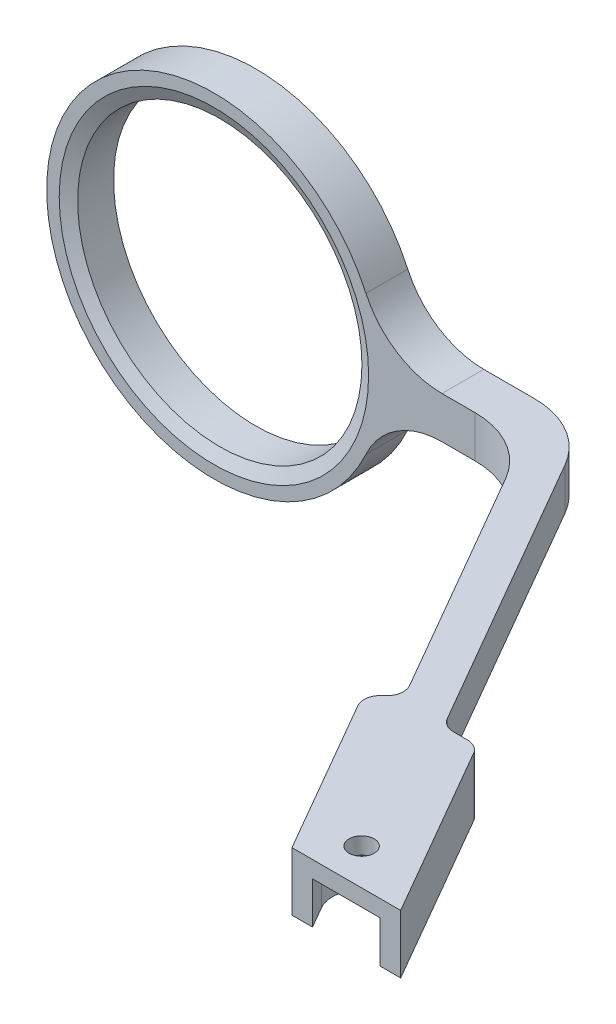
ISO-10303-21;
HEADER;
FILE_DESCRIPTION(('STEP AP214'),'2;1');
FILE_NAME('part.step','',(''),(''),'','','');
FILE_SCHEMA(('AUTOMOTIVE_DESIGN { 1 0 10303 214 1 1 1 1 }'));
ENDSEC;
DATA;
#1=APPLICATION_CONTEXT('core data for automotive mechanical design processes');
#2=APPLICATION_PROTOCOL_DEFINITION('international standard','automotive_design',2000,#1);
#3=PRODUCT_CONTEXT('',#1,'mechanical');
#4=PRODUCT('Part','Part','',(#3));
#5=PRODUCT_RELATED_PRODUCT_CATEGORY('part','',(#4));
#6=PRODUCT_DEFINITION_FORMATION('','',#4);
#7=PRODUCT_DEFINITION_CONTEXT('part definition',#1,'design');
#8=PRODUCT_DEFINITION('design','',#6,#7);
#9=PRODUCT_DEFINITION_SHAPE('','',#8);
#10=(LENGTH_UNIT() NAMED_UNIT(*) SI_UNIT(.MILLI.,.METRE.));
#11=(NAMED_UNIT(*) PLANE_ANGLE_UNIT() SI_UNIT($,.RADIAN.));
#12=(NAMED_UNIT(*) SI_UNIT($,.STERADIAN.) SOLID_ANGLE_UNIT());
#13=UNCERTAINTY_MEASURE_WITH_UNIT(LENGTH_MEASURE(1.E-05),#10,'distance_accuracy_value','');
#14=(GEOMETRIC_REPRESENTATION_CONTEXT(3) GLOBAL_UNCERTAINTY_ASSIGNED_CONTEXT((#13)) GLOBAL_UNIT_ASSIGNED_CONTEXT((#10,
#11,#12)) REPRESENTATION_CONTEXT('',''));
#15=CARTESIAN_POINT('',(0.,0.,0.));
#16=DIRECTION('',(0.,0.,1.));
#17=DIRECTION('',(1.,0.,0.));
#18=AXIS2_PLACEMENT_3D('',#15,#16,#17);
#19=CARTESIAN_POINT('',(69.3316150746193,0.500000000000026,56.6698729810778));
#20=DIRECTION('',(0.,-1.,0.));
#21=DIRECTION('',(1.,0.,0.));
#22=AXIS2_PLACEMENT_3D('',#19,#20,#21);
#23=CYLINDRICAL_SURFACE('',#22,3.50000000000001);
#24=DIRECTION('',(0.,-1.,0.));
#25=VECTOR('',#24,1.);
#26=CARTESIAN_POINT('',(65.9418066937666,0.500000000000025,55.7985526375181));
#27=LINE('',#26,#25);
#28=CARTESIAN_POINT('',(65.9418066937666,0.500000000000025,55.7985526375181));
#29=VERTEX_POINT('',#28);
#30=CARTESIAN_POINT('',(65.9418066937666,-0.999999999999975,55.7985526375181));
#31=VERTEX_POINT('',#30);
#32=EDGE_CURVE('E224',#29,#31,#27,.T.);
#33=ORIENTED_EDGE('',*,*,#32,.F.);
#34=CARTESIAN_POINT('',(69.3316150746193,0.500000000000026,56.6698729810778));
#35=DIRECTION('',(0.,-1.,0.));
#36=DIRECTION('',(1.,0.,0.));
#37=AXIS2_PLACEMENT_3D('',#34,#35,#36);
#38=CIRCLE('',#37,3.50000000000001);
#39=CARTESIAN_POINT('',(66.3005261613738,0.500000000000026,58.4198729810778));
#40=VERTEX_POINT('',#39);
#41=EDGE_CURVE('E251',#40,#29,#38,.T.);
#42=ORIENTED_EDGE('',*,*,#41,.F.);
#43=DIRECTION('',(0.,-1.,0.));
#44=VECTOR('',#43,1.);
#45=CARTESIAN_POINT('',(66.3005261613738,0.500000000000026,58.4198729810778));
#46=LINE('',#45,#44);
#47=CARTESIAN_POINT('',(66.3005261613738,-4.49999999999997,58.4198729810778));
#48=VERTEX_POINT('',#47);
#49=EDGE_CURVE('E270',#40,#48,#46,.T.);
#50=ORIENTED_EDGE('',*,*,#49,.T.);
#51=CARTESIAN_POINT('',(69.3316150746193,-4.49999999999997,56.6698729810778));
#52=DIRECTION('',(0.,-1.,0.));
#53=DIRECTION('',(1.,0.,0.));
#54=AXIS2_PLACEMENT_3D('',#51,#52,#53);
#55=CIRCLE('',#54,3.50000000000001);
#56=CARTESIAN_POINT('',(72.3627039878648,-4.49999999999997,54.9198729810778));
#57=VERTEX_POINT('',#56);
#58=EDGE_CURVE('E250',#48,#57,#55,.T.);
#59=ORIENTED_EDGE('',*,*,#58,.T.);
#60=DIRECTION('',(0.,-1.,0.));
#61=VECTOR('',#60,1.);
#62=CARTESIAN_POINT('',(72.3627039878648,0.500000000000029,54.9198729810778));
#63=LINE('',#62,#61);
#64=CARTESIAN_POINT('',(72.3627039878648,0.500000000000029,54.9198729810778));
#65=VERTEX_POINT('',#64);
#66=EDGE_CURVE('E263',#65,#57,#63,.T.);
#67=ORIENTED_EDGE('',*,*,#66,.F.);
#68=CARTESIAN_POINT('',(70.2719337126888,0.500000000000027,53.2985526375181));
#69=VERTEX_POINT('',#68);
#70=EDGE_CURVE('E255',#69,#65,#38,.T.);
#71=ORIENTED_EDGE('',*,*,#70,.F.);
#72=DIRECTION('',(0.,-1.,0.));
#73=VECTOR('',#72,1.);
#74=CARTESIAN_POINT('',(70.2719337126888,0.500000000000027,53.2985526375182));
#75=LINE('',#74,#73);
#76=CARTESIAN_POINT('',(70.2719337126888,-0.999999999999972,53.2985526375181));
#77=VERTEX_POINT('',#76);
#78=EDGE_CURVE('E241',#77,#69,#75,.F.);
#79=ORIENTED_EDGE('',*,*,#78,.F.);
#80=CARTESIAN_POINT('',(69.3316150746193,-0.999999999999973,56.6698729810778));
#81=DIRECTION('',(0.,-1.,0.));
#82=DIRECTION('',(1.,0.,0.));
#83=AXIS2_PLACEMENT_3D('',#80,#81,#82);
#84=CIRCLE('',#83,3.50000000000001);
#85=EDGE_CURVE('E363',#77,#31,#84,.F.);
#86=ORIENTED_EDGE('',*,*,#85,.T.);
#87=EDGE_LOOP('',(#33,#42,#50,#59,#67,#71,#79,#86));
#88=FACE_BOUND('',#87,.T.);
#89=ADVANCED_FACE('F46',(#88),#23,.F.);
#90=CARTESIAN_POINT('',(74.3316150746192,-74.0167776404917,61.));
#91=DIRECTION('',(0.,0.,1.));
#92=DIRECTION('',(1.,0.,0.));
#93=AXIS2_PLACEMENT_3D('',#90,#91,#92);
#94=PLANE('',#93);
#95=DIRECTION('',(1.,0.,0.));
#96=VECTOR('',#95,1.);
#97=CARTESIAN_POINT('',(65.3316150746193,-4.49999999999998,61.));
#98=LINE('',#97,#96);
#99=CARTESIAN_POINT('',(65.3316150746193,-4.49999999999998,61.));
#100=VERTEX_POINT('',#99);
#101=CARTESIAN_POINT('',(67.7901631902919,-4.49999999999997,61.));
#102=VERTEX_POINT('',#101);
#103=EDGE_CURVE('E284',#100,#102,#98,.T.);
#104=ORIENTED_EDGE('',*,*,#103,.T.);
#105=DIRECTION('',(0.,-1.,0.));
#106=VECTOR('',#105,1.);
#107=CARTESIAN_POINT('',(67.7901631902919,0.500000000000026,61.));
#108=LINE('',#107,#106);
#109=CARTESIAN_POINT('',(67.7901631902919,0.500000000000026,61.));
#110=VERTEX_POINT('',#109);
#111=EDGE_CURVE('E273',#110,#102,#108,.T.);
#112=ORIENTED_EDGE('',*,*,#111,.F.);
#113=DIRECTION('',(-1.,0.,0.));
#114=VECTOR('',#113,1.);
#115=CARTESIAN_POINT('',(0.,0.49999999999999,61.));
#116=LINE('',#115,#114);
#117=CARTESIAN_POINT('',(75.8730669589466,0.500000000000031,61.));
#118=VERTEX_POINT('',#117);
#119=EDGE_CURVE('E258',#118,#110,#116,.T.);
#120=ORIENTED_EDGE('',*,*,#119,.F.);
#121=DIRECTION('',(0.,-1.,0.));
#122=VECTOR('',#121,1.);
#123=CARTESIAN_POINT('',(75.8730669589466,0.500000000000031,61.));
#124=LINE('',#123,#122);
#125=CARTESIAN_POINT('',(75.8730669589466,-4.49999999999997,61.));
#126=VERTEX_POINT('',#125);
#127=EDGE_CURVE('E275',#118,#126,#124,.T.);
#128=ORIENTED_EDGE('',*,*,#127,.T.);
#129=CARTESIAN_POINT('',(78.3316150746193,-4.49999999999997,61.));
#130=VERTEX_POINT('',#129);
#131=EDGE_CURVE('E282',#126,#130,#98,.T.);
#132=ORIENTED_EDGE('',*,*,#131,.T.);
#133=DIRECTION('',(0.,1.,0.));
#134=VECTOR('',#133,1.);
#135=CARTESIAN_POINT('',(78.3316150746193,-4.49999999999997,61.));
#136=LINE('',#135,#134);
#137=CARTESIAN_POINT('',(78.3316150746193,2.50000000000003,61.));
#138=VERTEX_POINT('',#137);
#139=EDGE_CURVE('E300',#130,#138,#136,.T.);
#140=ORIENTED_EDGE('',*,*,#139,.T.);
#141=DIRECTION('',(1.,0.,0.));
#142=VECTOR('',#141,1.);
#143=CARTESIAN_POINT('',(74.3316150746192,2.50000000000003,61.));
#144=LINE('',#143,#142);
#145=CARTESIAN_POINT('',(65.3316150746193,2.50000000000002,61.));
#146=VERTEX_POINT('',#145);
#147=EDGE_CURVE('E307',#146,#138,#144,.T.);
#148=ORIENTED_EDGE('',*,*,#147,.F.);
#149=DIRECTION('',(0.,1.,0.));
#150=VECTOR('',#149,1.);
#151=CARTESIAN_POINT('',(65.3316150746193,-4.49999999999998,61.));
#152=LINE('',#151,#150);
#153=EDGE_CURVE('E293',#100,#146,#152,.T.);
#154=ORIENTED_EDGE('',*,*,#153,.F.);
#155=EDGE_LOOP('',(#104,#112,#120,#128,#132,#140,#148,#154));
#156=FACE_BOUND('',#155,.T.);
#157=ADVANCED_FACE('F506',(#156),#94,.T.);
#158=CARTESIAN_POINT('',(0.,-4.50000000000001,0.));
#159=DIRECTION('',(0.,-1.,0.));
#160=DIRECTION('',(1.,0.,0.));
#161=AXIS2_PLACEMENT_3D('',#158,#159,#160);
#162=PLANE('',#161);
#163=DIRECTION('',(0.5,0.,0.866025403784438));
#164=VECTOR('',#163,1.);
#165=CARTESIAN_POINT('',(65.3316150746193,-4.49999999999998,61.));
#166=LINE('',#165,#164);
#167=CARTESIAN_POINT('',(54.5636658821881,-4.49999999999998,42.349364905389));
#168=VERTEX_POINT('',#167);
#169=EDGE_CURVE('E280',#168,#100,#166,.T.);
#170=ORIENTED_EDGE('',*,*,#169,.F.);
#171=CARTESIAN_POINT('',(56.295716689757,-4.49999999999998,41.349364905389));
#172=DIRECTION('',(0.,-1.,0.));
#173=DIRECTION('',(1.,0.,0.));
#174=AXIS2_PLACEMENT_3D('',#171,#172,#173);
#175=CIRCLE('',#174,2.);
#176=CARTESIAN_POINT('',(56.295716689757,-4.49999999999998,39.349364905389));
#177=VERTEX_POINT('',#176);
#178=EDGE_CURVE('E401',#168,#177,#175,.T.);
#179=ORIENTED_EDGE('',*,*,#178,.T.);
#180=DIRECTION('',(-1.,0.,0.));
#181=VECTOR('',#180,1.);
#182=CARTESIAN_POINT('',(52.8316150746193,-4.49999999999998,39.349364905389));
#183=LINE('',#182,#181);
#184=CARTESIAN_POINT('',(64.67691453624,-4.49999999999998,39.349364905389));
#185=VERTEX_POINT('',#184);
#186=EDGE_CURVE('E290',#185,#177,#183,.T.);
#187=ORIENTED_EDGE('',*,*,#186,.F.);
#188=CARTESIAN_POINT('',(64.67691453624,-4.49999999999998,41.349364905389));
#189=DIRECTION('',(0.,-1.,0.));
#190=DIRECTION('',(1.,0.,0.));
#191=AXIS2_PLACEMENT_3D('',#188,#189,#190);
#192=CIRCLE('',#191,2.);
#193=CARTESIAN_POINT('',(66.4089653438089,-4.49999999999998,40.349364905389));
#194=VERTEX_POINT('',#193);
#195=EDGE_CURVE('E399',#185,#194,#192,.T.);
#196=ORIENTED_EDGE('',*,*,#195,.T.);
#197=DIRECTION('',(-0.5,0.,-0.866025403784439));
#198=VECTOR('',#197,1.);
#199=CARTESIAN_POINT('',(65.8316150746193,-4.49999999999998,39.349364905389));
#200=LINE('',#199,#198);
#201=EDGE_CURVE('E287',#130,#194,#200,.T.);
#202=ORIENTED_EDGE('',*,*,#201,.F.);
#203=ORIENTED_EDGE('',*,*,#131,.F.);
#204=DIRECTION('',(0.5,0.,0.866025403784439));
#205=VECTOR('',#204,1.);
#206=CARTESIAN_POINT('',(30.4910254037846,-4.49999999999999,-17.6040017247428));
#207=LINE('',#206,#205);
#208=EDGE_CURVE('E265',#57,#126,#207,.T.);
#209=ORIENTED_EDGE('',*,*,#208,.F.);
#210=ORIENTED_EDGE('',*,*,#58,.F.);
#211=DIRECTION('',(0.499999999999994,0.,0.866025403784442));
#212=VECTOR('',#211,1.);
#213=CARTESIAN_POINT('',(24.4288475772942,-4.5,-14.1040017247429));
#214=LINE('',#213,#212);
#215=EDGE_CURVE('E267',#48,#102,#214,.T.);
#216=ORIENTED_EDGE('',*,*,#215,.T.);
#217=ORIENTED_EDGE('',*,*,#103,.F.);
#218=EDGE_LOOP('',(#170,#179,#187,#196,#202,#203,#209,#210,#216,#217));
#219=FACE_BOUND('',#218,.T.);
#220=ADVANCED_FACE('F448',(#219),#162,.T.);
#221=CARTESIAN_POINT('',(0.,0.,5.));
#222=DIRECTION('',(0.,0.,-1.));
#223=DIRECTION('',(-1.,0.,0.));
#224=AXIS2_PLACEMENT_3D('',#221,#222,#223);
#225=CYLINDRICAL_SURFACE('',#224,20.);
#226=CARTESIAN_POINT('',(0.,0.,0.));
#227=DIRECTION('',(0.,0.,1.));
#228=DIRECTION('',(1.,0.,0.));
#229=AXIS2_PLACEMENT_3D('',#226,#227,#228);
#230=CIRCLE('',#229,20.);
#231=CARTESIAN_POINT('',(18.1811868577262,8.33333333333334,0.));
#232=VERTEX_POINT('',#231);
#233=CARTESIAN_POINT('',(18.1811868577262,-8.33333333333333,0.));
#234=VERTEX_POINT('',#233);
#235=EDGE_CURVE('E318',#232,#234,#230,.T.);
#236=ORIENTED_EDGE('',*,*,#235,.T.);
#237=DIRECTION('',(0.,0.,-1.));
#238=VECTOR('',#237,1.);
#239=CARTESIAN_POINT('',(18.1811868577262,-8.33333333333333,5.));
#240=LINE('',#239,#238);
#241=CARTESIAN_POINT('',(18.1811868577262,-8.33333333333333,5.));
#242=VERTEX_POINT('',#241);
#243=EDGE_CURVE('E351',#234,#242,#240,.F.);
#244=ORIENTED_EDGE('',*,*,#243,.T.);
#245=CARTESIAN_POINT('',(0.,0.,5.));
#246=DIRECTION('',(0.,0.,1.));
#247=DIRECTION('',(1.,0.,0.));
#248=AXIS2_PLACEMENT_3D('',#245,#246,#247);
#249=CIRCLE('',#248,20.);
#250=CARTESIAN_POINT('',(18.1811868577262,8.33333333333334,5.));
#251=VERTEX_POINT('',#250);
#252=EDGE_CURVE('E319',#251,#242,#249,.T.);
#253=ORIENTED_EDGE('',*,*,#252,.F.);
#254=DIRECTION('',(0.,0.,-1.));
#255=VECTOR('',#254,1.);
#256=CARTESIAN_POINT('',(18.1811868577262,8.33333333333334,5.));
#257=LINE('',#256,#255);
#258=EDGE_CURVE('E348',#251,#232,#257,.T.);
#259=ORIENTED_EDGE('',*,*,#258,.T.);
#260=EDGE_LOOP('',(#236,#244,#253,#259));
#261=FACE_BOUND('',#260,.T.);
#262=ADVANCED_FACE('F498',(#261),#225,.T.);
#263=CARTESIAN_POINT('',(0.,-2.49999999999999,5.));
#264=DIRECTION('',(0.,1.,0.));
#265=DIRECTION('',(-1.,0.,0.));
#266=AXIS2_PLACEMENT_3D('',#263,#264,#265);
#267=PLANE('',#266);
#268=DIRECTION('',(1.,0.,0.));
#269=VECTOR('',#268,1.);
#270=CARTESIAN_POINT('',(0.,-2.49999999999999,0.));
#271=LINE('',#270,#269);
#272=CARTESIAN_POINT('',(27.2717802865893,-2.49999999999999,0.));
#273=VERTEX_POINT('',#272);
#274=CARTESIAN_POINT('',(33.3397459621553,-2.49999999999999,0.));
#275=VERTEX_POINT('',#274);
#276=EDGE_CURVE('E332',#273,#275,#271,.T.);
#277=ORIENTED_EDGE('',*,*,#276,.T.);
#278=CARTESIAN_POINT('',(33.3397459621553,-2.49999999999999,10.));
#279=DIRECTION('',(0.,1.,0.));
#280=DIRECTION('',(-1.,0.,0.));
#281=AXIS2_PLACEMENT_3D('',#278,#279,#280);
#282=CIRCLE('',#281,10.);
#283=CARTESIAN_POINT('',(41.9999999999997,-2.49999999999999,4.99999999999996));
#284=VERTEX_POINT('',#283);
#285=EDGE_CURVE('E377',#275,#284,#282,.F.);
#286=ORIENTED_EDGE('',*,*,#285,.T.);
#287=DIRECTION('',(0.500000000000004,0.,0.866025403784436));
#288=VECTOR('',#287,1.);
#289=CARTESIAN_POINT('',(39.1132486540516,-2.49999999999999,0.));
#290=LINE('',#289,#288);
#291=CARTESIAN_POINT('',(61.2542648054294,-2.49999999999999,38.3493649053891));
#292=VERTEX_POINT('',#291);
#293=EDGE_CURVE('E310',#284,#292,#290,.T.);
#294=ORIENTED_EDGE('',*,*,#293,.T.);
#295=CARTESIAN_POINT('',(62.9863156129982,-2.49999999999999,37.349364905389));
#296=DIRECTION('',(0.,1.,0.));
#297=DIRECTION('',(-1.,0.,0.));
#298=AXIS2_PLACEMENT_3D('',#295,#296,#297);
#299=CIRCLE('',#298,2.);
#300=CARTESIAN_POINT('',(62.9863156129982,-2.49999999999999,39.349364905389));
#301=VERTEX_POINT('',#300);
#302=EDGE_CURVE('E420',#292,#301,#299,.T.);
#303=ORIENTED_EDGE('',*,*,#302,.T.);
#304=DIRECTION('',(-1.,0.,0.));
#305=VECTOR('',#304,1.);
#306=CARTESIAN_POINT('',(0.,-2.49999999999999,39.3493649053891));
#307=LINE('',#306,#305);
#308=CARTESIAN_POINT('',(56.295716689757,-2.49999999999999,39.349364905389));
#309=VERTEX_POINT('',#308);
#310=EDGE_CURVE('E303',#301,#309,#307,.T.);
#311=ORIENTED_EDGE('',*,*,#310,.T.);
#312=CARTESIAN_POINT('',(56.295716689757,-2.49999999999999,41.349364905389));
#313=DIRECTION('',(0.,1.,0.));
#314=DIRECTION('',(-1.,0.,0.));
#315=AXIS2_PLACEMENT_3D('',#312,#313,#314);
#316=CIRCLE('',#315,2.);
#317=CARTESIAN_POINT('',(55.0726811156206,-2.49999999999999,39.7669035363829));
#318=VERTEX_POINT('',#317);
#319=EDGE_CURVE('E411',#318,#309,#316,.F.);
#320=ORIENTED_EDGE('',*,*,#319,.F.);
#321=CARTESIAN_POINT('',(53.8496455414842,-2.49999999999999,38.1844421673767));
#322=DIRECTION('',(0.,1.,0.));
#323=DIRECTION('',(-1.,0.,0.));
#324=AXIS2_PLACEMENT_3D('',#321,#322,#323);
#325=CIRCLE('',#324,2.);
#326=CARTESIAN_POINT('',(55.5816963490531,-2.49999999999999,37.1844421673767));
#327=VERTEX_POINT('',#326);
#328=EDGE_CURVE('E54',#318,#327,#325,.T.);
#329=ORIENTED_EDGE('',*,*,#328,.T.);
#330=DIRECTION('',(-0.500000000000004,0.,-0.866025403784436));
#331=VECTOR('',#330,1.);
#332=CARTESIAN_POINT('',(69.3316150746194,-2.49999999999999,61.));
#333=LINE('',#332,#331);
#334=CARTESIAN_POINT('',(39.8867513459481,-2.49999999999999,9.99999999999996));
#335=VERTEX_POINT('',#334);
#336=EDGE_CURVE('E308',#327,#335,#333,.T.);
#337=ORIENTED_EDGE('',*,*,#336,.T.);
#338=CARTESIAN_POINT('',(31.2264973081038,-2.49999999999999,15.));
#339=DIRECTION('',(0.,1.,0.));
#340=DIRECTION('',(-1.,0.,0.));
#341=AXIS2_PLACEMENT_3D('',#338,#339,#340);
#342=CIRCLE('',#341,10.);
#343=CARTESIAN_POINT('',(31.2264973081038,-2.49999999999999,5.));
#344=VERTEX_POINT('',#343);
#345=EDGE_CURVE('E384',#335,#344,#342,.T.);
#346=ORIENTED_EDGE('',*,*,#345,.T.);
#347=DIRECTION('',(1.,0.,0.));
#348=VECTOR('',#347,1.);
#349=CARTESIAN_POINT('',(0.,-2.49999999999999,5.));
#350=LINE('',#349,#348);
#351=CARTESIAN_POINT('',(27.2717802865893,-2.49999999999999,5.));
#352=VERTEX_POINT('',#351);
#353=EDGE_CURVE('E322',#352,#344,#350,.T.);
#354=ORIENTED_EDGE('',*,*,#353,.F.);
#355=DIRECTION('',(0.,0.,1.));
#356=VECTOR('',#355,1.);
#357=CARTESIAN_POINT('',(27.2717802865893,-2.49999999999999,0.));
#358=LINE('',#357,#356);
#359=EDGE_CURVE('E345',#352,#273,#358,.F.);
#360=ORIENTED_EDGE('',*,*,#359,.T.);
#361=EDGE_LOOP('',(#277,#286,#294,#303,#311,#320,#329,#337,#346,#354,#360));
#362=FACE_BOUND('',#361,.T.);
#363=ADVANCED_FACE('F424',(#362),#267,.F.);
#364=CARTESIAN_POINT('',(0.,2.49999999999999,5.));
#365=DIRECTION('',(0.,1.,0.));
#366=DIRECTION('',(-1.,0.,0.));
#367=AXIS2_PLACEMENT_3D('',#364,#365,#366);
#368=PLANE('',#367);
#369=CARTESIAN_POINT('',(69.3316150746193,2.50000000000003,56.6698729810778));
#370=DIRECTION('',(0.,1.,0.));
#371=DIRECTION('',(-1.,0.,0.));
#372=AXIS2_PLACEMENT_3D('',#369,#370,#371);
#373=CIRCLE('',#372,1.5);
#374=CARTESIAN_POINT('',(67.8316150746193,2.50000000000002,56.6698729810778));
#375=VERTEX_POINT('',#374);
#376=EDGE_CURVE('E370',#375,#375,#373,.T.);
#377=ORIENTED_EDGE('',*,*,#376,.F.);
#378=EDGE_LOOP('',(#377));
#379=FACE_BOUND('',#378,.T.);
#380=DIRECTION('',(0.500000000000004,0.,0.866025403784436));
#381=VECTOR('',#380,1.);
#382=CARTESIAN_POINT('',(69.3316150746194,2.50000000000003,61.));
#383=LINE('',#382,#381);
#384=CARTESIAN_POINT('',(39.8867513459481,2.50000000000001,9.99999999999998));
#385=VERTEX_POINT('',#384);
#386=CARTESIAN_POINT('',(55.5816963490531,2.50000000000002,37.1844421673767));
#387=VERTEX_POINT('',#386);
#388=EDGE_CURVE('E311',#385,#387,#383,.T.);
#389=ORIENTED_EDGE('',*,*,#388,.T.);
#390=CARTESIAN_POINT('',(53.8496455414842,2.50000000000002,38.1844421673767));
#391=DIRECTION('',(0.,1.,0.));
#392=DIRECTION('',(-1.,0.,0.));
#393=AXIS2_PLACEMENT_3D('',#390,#391,#392);
#394=CIRCLE('',#393,2.);
#395=CARTESIAN_POINT('',(55.0726811156206,2.50000000000002,39.7669035363829));
#396=VERTEX_POINT('',#395);
#397=EDGE_CURVE('E12',#387,#396,#394,.F.);
#398=ORIENTED_EDGE('',*,*,#397,.T.);
#399=CARTESIAN_POINT('',(56.295716689757,2.50000000000002,41.349364905389));
#400=DIRECTION('',(0.,1.,0.));
#401=DIRECTION('',(-1.,0.,0.));
#402=AXIS2_PLACEMENT_3D('',#399,#400,#401);
#403=CIRCLE('',#402,2.);
#404=CARTESIAN_POINT('',(54.5636658821881,2.50000000000002,42.349364905389));
#405=VERTEX_POINT('',#404);
#406=EDGE_CURVE('E395',#396,#405,#403,.T.);
#407=ORIENTED_EDGE('',*,*,#406,.T.);
#408=DIRECTION('',(0.5,0.,0.866025403784438));
#409=VECTOR('',#408,1.);
#410=CARTESIAN_POINT('',(65.3316150746193,2.50000000000002,61.));
#411=LINE('',#410,#409);
#412=EDGE_CURVE('E272',#405,#146,#411,.T.);
#413=ORIENTED_EDGE('',*,*,#412,.T.);
#414=ORIENTED_EDGE('',*,*,#147,.T.);
#415=DIRECTION('',(-0.5,0.,-0.866025403784439));
#416=VECTOR('',#415,1.);
#417=CARTESIAN_POINT('',(65.8316150746193,2.50000000000002,39.349364905389));
#418=LINE('',#417,#416);
#419=CARTESIAN_POINT('',(66.4089653438089,2.50000000000002,40.349364905389));
#420=VERTEX_POINT('',#419);
#421=EDGE_CURVE('E295',#138,#420,#418,.T.);
#422=ORIENTED_EDGE('',*,*,#421,.T.);
#423=CARTESIAN_POINT('',(64.67691453624,2.50000000000003,41.349364905389));
#424=DIRECTION('',(0.,1.,0.));
#425=DIRECTION('',(-1.,0.,0.));
#426=AXIS2_PLACEMENT_3D('',#423,#424,#425);
#427=CIRCLE('',#426,2.);
#428=CARTESIAN_POINT('',(64.67691453624,2.50000000000002,39.349364905389));
#429=VERTEX_POINT('',#428);
#430=EDGE_CURVE('E393',#420,#429,#427,.T.);
#431=ORIENTED_EDGE('',*,*,#430,.T.);
#432=DIRECTION('',(-1.,0.,0.));
#433=VECTOR('',#432,1.);
#434=CARTESIAN_POINT('',(52.8316150746193,2.50000000000002,39.349364905389));
#435=LINE('',#434,#433);
#436=CARTESIAN_POINT('',(62.9863156129982,2.50000000000002,39.349364905389));
#437=VERTEX_POINT('',#436);
#438=EDGE_CURVE('E283',#429,#437,#435,.T.);
#439=ORIENTED_EDGE('',*,*,#438,.T.);
#440=CARTESIAN_POINT('',(62.9863156129982,2.50000000000003,37.349364905389));
#441=DIRECTION('',(0.,1.,0.));
#442=DIRECTION('',(-1.,0.,0.));
#443=AXIS2_PLACEMENT_3D('',#440,#441,#442);
#444=CIRCLE('',#443,2.);
#445=CARTESIAN_POINT('',(61.2542648054294,2.50000000000002,38.349364905389));
#446=VERTEX_POINT('',#445);
#447=EDGE_CURVE('E418',#437,#446,#444,.F.);
#448=ORIENTED_EDGE('',*,*,#447,.T.);
#449=DIRECTION('',(-0.500000000000004,0.,-0.866025403784436));
#450=VECTOR('',#449,1.);
#451=CARTESIAN_POINT('',(39.1132486540516,2.50000000000001,0.));
#452=LINE('',#451,#450);
#453=CARTESIAN_POINT('',(41.9999999999997,2.50000000000001,4.99999999999996));
#454=VERTEX_POINT('',#453);
#455=EDGE_CURVE('E313',#446,#454,#452,.T.);
#456=ORIENTED_EDGE('',*,*,#455,.T.);
#457=CARTESIAN_POINT('',(33.3397459621553,2.5,10.));
#458=DIRECTION('',(0.,1.,0.));
#459=DIRECTION('',(-1.,0.,0.));
#460=AXIS2_PLACEMENT_3D('',#457,#458,#459);
#461=CIRCLE('',#460,10.);
#462=CARTESIAN_POINT('',(33.3397459621553,2.50000000000001,0.));
#463=VERTEX_POINT('',#462);
#464=EDGE_CURVE('E373',#454,#463,#461,.T.);
#465=ORIENTED_EDGE('',*,*,#464,.T.);
#466=DIRECTION('',(1.,0.,0.));
#467=VECTOR('',#466,1.);
#468=CARTESIAN_POINT('',(0.,2.49999999999999,0.));
#469=LINE('',#468,#467);
#470=CARTESIAN_POINT('',(27.2717802865893,2.50000000000001,0.));
#471=VERTEX_POINT('',#470);
#472=EDGE_CURVE('E335',#471,#463,#469,.T.);
#473=ORIENTED_EDGE('',*,*,#472,.F.);
#474=DIRECTION('',(0.,0.,-1.));
#475=VECTOR('',#474,1.);
#476=CARTESIAN_POINT('',(27.2717802865893,2.50000000000001,5.));
#477=LINE('',#476,#475);
#478=CARTESIAN_POINT('',(27.2717802865893,2.50000000000001,5.));
#479=VERTEX_POINT('',#478);
#480=EDGE_CURVE('E353',#471,#479,#477,.F.);
#481=ORIENTED_EDGE('',*,*,#480,.T.);
#482=DIRECTION('',(1.,0.,0.));
#483=VECTOR('',#482,1.);
#484=CARTESIAN_POINT('',(0.,2.49999999999999,5.));
#485=LINE('',#484,#483);
#486=CARTESIAN_POINT('',(31.2264973081038,2.50000000000001,5.));
#487=VERTEX_POINT('',#486);
#488=EDGE_CURVE('E326',#479,#487,#485,.T.);
#489=ORIENTED_EDGE('',*,*,#488,.T.);
#490=CARTESIAN_POINT('',(31.2264973081038,2.5,15.));
#491=DIRECTION('',(0.,1.,0.));
#492=DIRECTION('',(-1.,0.,0.));
#493=AXIS2_PLACEMENT_3D('',#490,#491,#492);
#494=CIRCLE('',#493,10.);
#495=EDGE_CURVE('E386',#487,#385,#494,.F.);
#496=ORIENTED_EDGE('',*,*,#495,.T.);
#497=EDGE_LOOP('',(#389,#398,#407,#413,#414,#422,#431,#439,#448,#456,#465,#473,#481,#489,#496));
#498=FACE_BOUND('',#497,.T.);
#499=ADVANCED_FACE('F434',(#379,#498),#368,.T.);
#500=CARTESIAN_POINT('',(0.,0.,5.));
#501=DIRECTION('',(0.,0.,-1.));
#502=DIRECTION('',(-1.,0.,0.));
#503=AXIS2_PLACEMENT_3D('',#500,#501,#502);
#504=CYLINDRICAL_SURFACE('',#503,17.);
#505=CARTESIAN_POINT('',(0.,0.,4.30053851276749));
#506=DIRECTION('',(0.,0.,1.));
#507=DIRECTION('',(1.,0.,0.));
#508=AXIS2_PLACEMENT_3D('',#505,#506,#507);
#509=CIRCLE('',#508,17.);
#510=CARTESIAN_POINT('',(17.,0.,4.30053851276749));
#511=VERTEX_POINT('',#510);
#512=EDGE_CURVE('E329',#511,#511,#509,.T.);
#513=ORIENTED_EDGE('',*,*,#512,.T.);
#514=EDGE_LOOP('',(#513));
#515=FACE_BOUND('',#514,.T.);
#516=CARTESIAN_POINT('',(0.,0.,0.));
#517=DIRECTION('',(0.,0.,1.));
#518=DIRECTION('',(1.,0.,0.));
#519=AXIS2_PLACEMENT_3D('',#516,#517,#518);
#520=CIRCLE('',#519,17.);
#521=CARTESIAN_POINT('',(17.,0.,0.));
#522=VERTEX_POINT('',#521);
#523=EDGE_CURVE('E323',#522,#522,#520,.T.);
#524=ORIENTED_EDGE('',*,*,#523,.F.);
#525=EDGE_LOOP('',(#524));
#526=FACE_BOUND('',#525,.T.);
#527=ADVANCED_FACE('F536',(#515,#526),#504,.F.);
#528=CARTESIAN_POINT('',(0.,0.,5.));
#529=DIRECTION('',(0.,0.,1.));
#530=DIRECTION('',(1.,0.,0.));
#531=AXIS2_PLACEMENT_3D('',#528,#529,#530);
#532=PLANE('',#531);
#533=CARTESIAN_POINT('',(0.,0.,5.));
#534=DIRECTION('',(0.,0.,1.));
#535=DIRECTION('',(1.,0.,0.));
#536=AXIS2_PLACEMENT_3D('',#533,#534,#535);
#537=CIRCLE('',#536,18.5);
#538=CARTESIAN_POINT('',(18.5,0.,5.));
#539=VERTEX_POINT('',#538);
#540=EDGE_CURVE('E342',#539,#539,#537,.F.);
#541=ORIENTED_EDGE('',*,*,#540,.T.);
#542=EDGE_LOOP('',(#541));
#543=FACE_BOUND('',#542,.T.);
#544=ORIENTED_EDGE('',*,*,#353,.T.);
#545=DIRECTION('',(0.,-1.,0.));
#546=VECTOR('',#545,1.);
#547=CARTESIAN_POINT('',(31.2264973081038,2.50000000000002,5.));
#548=LINE('',#547,#546);
#549=EDGE_CURVE('E382',#344,#487,#548,.F.);
#550=ORIENTED_EDGE('',*,*,#549,.T.);
#551=ORIENTED_EDGE('',*,*,#488,.F.);
#552=CARTESIAN_POINT('',(27.2717802865893,12.5,5.));
#553=DIRECTION('',(0.,0.,1.));
#554=DIRECTION('',(1.,0.,0.));
#555=AXIS2_PLACEMENT_3D('',#552,#553,#554);
#556=CIRCLE('',#555,10.);
#557=EDGE_CURVE('E361',#479,#251,#556,.F.);
#558=ORIENTED_EDGE('',*,*,#557,.T.);
#559=ORIENTED_EDGE('',*,*,#252,.T.);
#560=CARTESIAN_POINT('',(27.2717802865893,-12.5,5.));
#561=DIRECTION('',(0.,0.,1.));
#562=DIRECTION('',(1.,0.,0.));
#563=AXIS2_PLACEMENT_3D('',#560,#561,#562);
#564=CIRCLE('',#563,10.);
#565=EDGE_CURVE('E357',#242,#352,#564,.F.);
#566=ORIENTED_EDGE('',*,*,#565,.T.);
#567=EDGE_LOOP('',(#544,#550,#551,#558,#559,#566));
#568=FACE_BOUND('',#567,.T.);
#569=ADVANCED_FACE('F471',(#543,#568),#532,.T.);
#570=CARTESIAN_POINT('',(0.,0.,0.));
#571=DIRECTION('',(0.,0.,1.));
#572=DIRECTION('',(1.,0.,0.));
#573=AXIS2_PLACEMENT_3D('',#570,#571,#572);
#574=PLANE('',#573);
#575=ORIENTED_EDGE('',*,*,#472,.T.);
#576=DIRECTION('',(0.,1.,0.));
#577=VECTOR('',#576,1.);
#578=CARTESIAN_POINT('',(33.3397459621553,-2.49999999999999,0.));
#579=LINE('',#578,#577);
#580=EDGE_CURVE('E375',#463,#275,#579,.F.);
#581=ORIENTED_EDGE('',*,*,#580,.T.);
#582=ORIENTED_EDGE('',*,*,#276,.F.);
#583=CARTESIAN_POINT('',(27.2717802865893,-12.5,0.));
#584=DIRECTION('',(0.,0.,1.));
#585=DIRECTION('',(1.,0.,0.));
#586=AXIS2_PLACEMENT_3D('',#583,#584,#585);
#587=CIRCLE('',#586,10.);
#588=EDGE_CURVE('E355',#273,#234,#587,.T.);
#589=ORIENTED_EDGE('',*,*,#588,.T.);
#590=ORIENTED_EDGE('',*,*,#235,.F.);
#591=CARTESIAN_POINT('',(27.2717802865893,12.5,0.));
#592=DIRECTION('',(0.,0.,1.));
#593=DIRECTION('',(1.,0.,0.));
#594=AXIS2_PLACEMENT_3D('',#591,#592,#593);
#595=CIRCLE('',#594,10.);
#596=EDGE_CURVE('E359',#232,#471,#595,.T.);
#597=ORIENTED_EDGE('',*,*,#596,.T.);
#598=EDGE_LOOP('',(#575,#581,#582,#589,#590,#597));
#599=FACE_BOUND('',#598,.T.);
#600=ORIENTED_EDGE('',*,*,#523,.T.);
#601=EDGE_LOOP('',(#600));
#602=FACE_BOUND('',#601,.T.);
#603=ADVANCED_FACE('F481',(#599,#602),#574,.F.);
#604=CARTESIAN_POINT('',(0.,0.,4.30053851276749));
#605=DIRECTION('',(0.,0.,1.));
#606=DIRECTION('',(1.,0.,0.));
#607=AXIS2_PLACEMENT_3D('',#604,#605,#606);
#608=CONICAL_SURFACE('',#607,17.,1.13446401379631);
#609=ORIENTED_EDGE('',*,*,#540,.F.);
#610=EDGE_LOOP('',(#609));
#611=FACE_BOUND('',#610,.T.);
#612=ORIENTED_EDGE('',*,*,#512,.F.);
#613=EDGE_LOOP('',(#612));
#614=FACE_BOUND('',#613,.T.);
#615=ADVANCED_FACE('F540',(#611,#614),#608,.F.);
#616=CARTESIAN_POINT('',(27.2717802865893,-12.5,5.));
#617=DIRECTION('',(0.,0.,-1.));
#618=DIRECTION('',(-1.,0.,0.));
#619=AXIS2_PLACEMENT_3D('',#616,#617,#618);
#620=CYLINDRICAL_SURFACE('',#619,10.);
#621=ORIENTED_EDGE('',*,*,#565,.F.);
#622=ORIENTED_EDGE('',*,*,#243,.F.);
#623=ORIENTED_EDGE('',*,*,#588,.F.);
#624=ORIENTED_EDGE('',*,*,#359,.F.);
#625=EDGE_LOOP('',(#621,#622,#623,#624));
#626=FACE_BOUND('',#625,.T.);
#627=ADVANCED_FACE('F477',(#626),#620,.F.);
#628=CARTESIAN_POINT('',(27.2717802865893,12.5,5.));
#629=DIRECTION('',(0.,0.,-1.));
#630=DIRECTION('',(-1.,0.,0.));
#631=AXIS2_PLACEMENT_3D('',#628,#629,#630);
#632=CYLINDRICAL_SURFACE('',#631,10.);
#633=ORIENTED_EDGE('',*,*,#557,.F.);
#634=ORIENTED_EDGE('',*,*,#480,.F.);
#635=ORIENTED_EDGE('',*,*,#596,.F.);
#636=ORIENTED_EDGE('',*,*,#258,.F.);
#637=EDGE_LOOP('',(#633,#634,#635,#636));
#638=FACE_BOUND('',#637,.T.);
#639=ADVANCED_FACE('F495',(#638),#632,.F.);
#640=CARTESIAN_POINT('',(69.3316150746194,-74.0167776404917,61.));
#641=DIRECTION('',(-0.866025403784436,0.,0.500000000000004));
#642=DIRECTION('',(0.500000000000004,0.,0.866025403784436));
#643=AXIS2_PLACEMENT_3D('',#640,#641,#642);
#644=PLANE('',#643);
#645=ORIENTED_EDGE('',*,*,#336,.F.);
#646=DIRECTION('',(0.,-1.,0.));
#647=VECTOR('',#646,1.);
#648=CARTESIAN_POINT('',(55.5816963490531,2.50000000000002,37.1844421673767));
#649=LINE('',#648,#647);
#650=EDGE_CURVE('E67',#327,#387,#649,.F.);
#651=ORIENTED_EDGE('',*,*,#650,.T.);
#652=ORIENTED_EDGE('',*,*,#388,.F.);
#653=DIRECTION('',(0.,-1.,0.));
#654=VECTOR('',#653,1.);
#655=CARTESIAN_POINT('',(39.8867513459481,-2.49999999999998,9.99999999999996));
#656=LINE('',#655,#654);
#657=EDGE_CURVE('E379',#385,#335,#656,.T.);
#658=ORIENTED_EDGE('',*,*,#657,.T.);
#659=EDGE_LOOP('',(#645,#651,#652,#658));
#660=FACE_BOUND('',#659,.T.);
#661=ADVANCED_FACE('F463',(#660),#644,.T.);
#662=CARTESIAN_POINT('',(39.1132486540516,-74.0167776404917,0.));
#663=DIRECTION('',(0.866025403784436,0.,-0.500000000000004));
#664=DIRECTION('',(-0.500000000000004,0.,-0.866025403784436));
#665=AXIS2_PLACEMENT_3D('',#662,#663,#664);
#666=PLANE('',#665);
#667=ORIENTED_EDGE('',*,*,#455,.F.);
#668=DIRECTION('',(0.,1.,0.));
#669=VECTOR('',#668,1.);
#670=CARTESIAN_POINT('',(61.2542648054294,-2.49999999999999,38.349364905389));
#671=LINE('',#670,#669);
#672=EDGE_CURVE('E409',#446,#292,#671,.F.);
#673=ORIENTED_EDGE('',*,*,#672,.T.);
#674=ORIENTED_EDGE('',*,*,#293,.F.);
#675=DIRECTION('',(0.,1.,0.));
#676=VECTOR('',#675,1.);
#677=CARTESIAN_POINT('',(41.9999999999997,2.50000000000002,4.99999999999996));
#678=LINE('',#677,#676);
#679=EDGE_CURVE('E365',#284,#454,#678,.T.);
#680=ORIENTED_EDGE('',*,*,#679,.T.);
#681=EDGE_LOOP('',(#667,#673,#674,#680));
#682=FACE_BOUND('',#681,.T.);
#683=ADVANCED_FACE('F491',(#682),#666,.T.);
#684=CARTESIAN_POINT('',(65.3316150746193,-4.49999999999998,61.));
#685=DIRECTION('',(-0.866025403784438,0.,0.5));
#686=DIRECTION('',(0.5,0.,0.866025403784438));
#687=AXIS2_PLACEMENT_3D('',#684,#685,#686);
#688=PLANE('',#687);
#689=ORIENTED_EDGE('',*,*,#412,.F.);
#690=DIRECTION('',(0.,1.,0.));
#691=VECTOR('',#690,1.);
#692=CARTESIAN_POINT('',(54.5636658821881,-4.49999999999998,42.349364905389));
#693=LINE('',#692,#691);
#694=EDGE_CURVE('E397',#405,#168,#693,.F.);
#695=ORIENTED_EDGE('',*,*,#694,.T.);
#696=ORIENTED_EDGE('',*,*,#169,.T.);
#697=ORIENTED_EDGE('',*,*,#153,.T.);
#698=EDGE_LOOP('',(#689,#695,#696,#697));
#699=FACE_BOUND('',#698,.T.);
#700=ADVANCED_FACE('F523',(#699),#688,.T.);
#701=CARTESIAN_POINT('',(52.8316150746193,-4.49999999999998,39.349364905389));
#702=DIRECTION('',(0.,0.,-1.));
#703=DIRECTION('',(-1.,0.,0.));
#704=AXIS2_PLACEMENT_3D('',#701,#702,#703);
#705=PLANE('',#704);
#706=ORIENTED_EDGE('',*,*,#310,.F.);
#707=DIRECTION('',(0.,1.,0.));
#708=VECTOR('',#707,1.);
#709=CARTESIAN_POINT('',(62.9863156129982,2.50000000000002,39.349364905389));
#710=LINE('',#709,#708);
#711=EDGE_CURVE('E406',#301,#437,#710,.T.);
#712=ORIENTED_EDGE('',*,*,#711,.T.);
#713=ORIENTED_EDGE('',*,*,#438,.F.);
#714=DIRECTION('',(0.,1.,0.));
#715=VECTOR('',#714,1.);
#716=CARTESIAN_POINT('',(64.67691453624,-4.49999999999998,39.349364905389));
#717=LINE('',#716,#715);
#718=EDGE_CURVE('E388',#429,#185,#717,.F.);
#719=ORIENTED_EDGE('',*,*,#718,.T.);
#720=ORIENTED_EDGE('',*,*,#186,.T.);
#721=DIRECTION('',(0.,1.,0.));
#722=VECTOR('',#721,1.);
#723=CARTESIAN_POINT('',(56.295716689757,-4.49999999999998,39.349364905389));
#724=LINE('',#723,#722);
#725=EDGE_CURVE('E390',#177,#309,#724,.T.);
#726=ORIENTED_EDGE('',*,*,#725,.T.);
#727=EDGE_LOOP('',(#706,#712,#713,#719,#720,#726));
#728=FACE_BOUND('',#727,.T.);
#729=ADVANCED_FACE('F431',(#728),#705,.T.);
#730=CARTESIAN_POINT('',(65.8316150746193,-4.49999999999998,39.349364905389));
#731=DIRECTION('',(0.866025403784439,0.,-0.5));
#732=DIRECTION('',(-0.5,0.,-0.866025403784439));
#733=AXIS2_PLACEMENT_3D('',#730,#731,#732);
#734=PLANE('',#733);
#735=ORIENTED_EDGE('',*,*,#201,.T.);
#736=DIRECTION('',(0.,1.,0.));
#737=VECTOR('',#736,1.);
#738=CARTESIAN_POINT('',(66.4089653438089,-4.49999999999998,40.349364905389));
#739=LINE('',#738,#737);
#740=EDGE_CURVE('E403',#194,#420,#739,.T.);
#741=ORIENTED_EDGE('',*,*,#740,.T.);
#742=ORIENTED_EDGE('',*,*,#421,.F.);
#743=ORIENTED_EDGE('',*,*,#139,.F.);
#744=EDGE_LOOP('',(#735,#741,#742,#743));
#745=FACE_BOUND('',#744,.T.);
#746=ADVANCED_FACE('F442',(#745),#734,.T.);
#747=CARTESIAN_POINT('',(24.4288475772942,0.500000000000003,-14.1040017247429));
#748=DIRECTION('',(0.866025403784442,0.,-0.499999999999994));
#749=DIRECTION('',(-0.499999999999994,0.,-0.866025403784442));
#750=AXIS2_PLACEMENT_3D('',#747,#748,#749);
#751=PLANE('',#750);
#752=ORIENTED_EDGE('',*,*,#215,.F.);
#753=ORIENTED_EDGE('',*,*,#49,.F.);
#754=DIRECTION('',(0.499999999999994,0.,0.866025403784442));
#755=VECTOR('',#754,1.);
#756=CARTESIAN_POINT('',(24.4288475772942,0.500000000000003,-14.1040017247429));
#757=LINE('',#756,#755);
#758=EDGE_CURVE('E261',#40,#110,#757,.T.);
#759=ORIENTED_EDGE('',*,*,#758,.T.);
#760=ORIENTED_EDGE('',*,*,#111,.T.);
#761=EDGE_LOOP('',(#752,#753,#759,#760));
#762=FACE_BOUND('',#761,.T.);
#763=ADVANCED_FACE('F526',(#762),#751,.T.);
#764=CARTESIAN_POINT('',(30.4910254037846,0.500000000000007,-17.6040017247428));
#765=DIRECTION('',(0.866025403784439,0.,-0.5));
#766=DIRECTION('',(-0.5,0.,-0.866025403784439));
#767=AXIS2_PLACEMENT_3D('',#764,#765,#766);
#768=PLANE('',#767);
#769=ORIENTED_EDGE('',*,*,#208,.T.);
#770=ORIENTED_EDGE('',*,*,#127,.F.);
#771=DIRECTION('',(0.5,0.,0.866025403784439));
#772=VECTOR('',#771,1.);
#773=CARTESIAN_POINT('',(30.4910254037846,0.500000000000007,-17.6040017247428));
#774=LINE('',#773,#772);
#775=EDGE_CURVE('E254',#65,#118,#774,.T.);
#776=ORIENTED_EDGE('',*,*,#775,.F.);
#777=ORIENTED_EDGE('',*,*,#66,.T.);
#778=EDGE_LOOP('',(#769,#770,#776,#777));
#779=FACE_BOUND('',#778,.T.);
#780=ADVANCED_FACE('F518',(#779),#768,.F.);
#781=CARTESIAN_POINT('',(0.,0.49999999999999,0.));
#782=DIRECTION('',(0.,-1.,0.));
#783=DIRECTION('',(1.,0.,0.));
#784=AXIS2_PLACEMENT_3D('',#781,#782,#783);
#785=PLANE('',#784);
#786=CARTESIAN_POINT('',(69.3316150746193,0.500000000000028,56.6698729810778));
#787=DIRECTION('',(0.,-1.,0.));
#788=DIRECTION('',(1.,0.,0.));
#789=AXIS2_PLACEMENT_3D('',#786,#787,#788);
#790=CIRCLE('',#789,1.5);
#791=CARTESIAN_POINT('',(70.8316150746193,0.500000000000029,56.6698729810778));
#792=VERTEX_POINT('',#791);
#793=EDGE_CURVE('E366',#792,#792,#790,.T.);
#794=ORIENTED_EDGE('',*,*,#793,.F.);
#795=EDGE_LOOP('',(#794));
#796=FACE_BOUND('',#795,.T.);
#797=ORIENTED_EDGE('',*,*,#41,.T.);
#798=DIRECTION('',(-0.499999999999999,0.,-0.866025403784439));
#799=VECTOR('',#798,1.);
#800=CARTESIAN_POINT('',(67.1665515651582,0.500000000000026,57.9198729810778));
#801=LINE('',#800,#799);
#802=CARTESIAN_POINT('',(59.1665515651582,0.500000000000021,44.0634665205268));
#803=VERTEX_POINT('',#802);
#804=EDGE_CURVE('E369',#29,#803,#801,.T.);
#805=ORIENTED_EDGE('',*,*,#804,.T.);
#806=DIRECTION('',(0.866025403784439,0.,-0.5));
#807=VECTOR('',#806,1.);
#808=CARTESIAN_POINT('',(59.1665515651582,0.500000000000021,44.0634665205268));
#809=LINE('',#808,#807);
#810=CARTESIAN_POINT('',(63.4966785840804,0.500000000000024,41.5634665205268));
#811=VERTEX_POINT('',#810);
#812=EDGE_CURVE('E240',#803,#811,#809,.T.);
#813=ORIENTED_EDGE('',*,*,#812,.T.);
#814=DIRECTION('',(0.5,0.,0.866025403784438));
#815=VECTOR('',#814,1.);
#816=CARTESIAN_POINT('',(63.4966785840804,0.500000000000024,41.5634665205268));
#817=LINE('',#816,#815);
#818=EDGE_CURVE('E228',#811,#69,#817,.T.);
#819=ORIENTED_EDGE('',*,*,#818,.T.);
#820=ORIENTED_EDGE('',*,*,#70,.T.);
#821=ORIENTED_EDGE('',*,*,#775,.T.);
#822=ORIENTED_EDGE('',*,*,#119,.T.);
#823=ORIENTED_EDGE('',*,*,#758,.F.);
#824=EDGE_LOOP('',(#797,#805,#813,#819,#820,#821,#822,#823));
#825=FACE_BOUND('',#824,.T.);
#826=ADVANCED_FACE('F557',(#796,#825),#785,.T.);
#827=CARTESIAN_POINT('',(0.,-1.00000000000001,0.));
#828=DIRECTION('',(0.,-1.,0.));
#829=DIRECTION('',(1.,0.,0.));
#830=AXIS2_PLACEMENT_3D('',#827,#828,#829);
#831=PLANE('',#830);
#832=DIRECTION('',(0.5,0.,0.866025403784438));
#833=VECTOR('',#832,1.);
#834=CARTESIAN_POINT('',(63.4966785840804,-0.999999999999976,41.5634665205268));
#835=LINE('',#834,#833);
#836=CARTESIAN_POINT('',(63.4966785840804,-0.999999999999976,41.5634665205268));
#837=VERTEX_POINT('',#836);
#838=EDGE_CURVE('E233',#837,#77,#835,.T.);
#839=ORIENTED_EDGE('',*,*,#838,.F.);
#840=DIRECTION('',(0.866025403784439,0.,-0.5));
#841=VECTOR('',#840,1.);
#842=CARTESIAN_POINT('',(59.1665515651582,-0.999999999999979,44.0634665205268));
#843=LINE('',#842,#841);
#844=CARTESIAN_POINT('',(59.1665515651582,-0.999999999999979,44.0634665205268));
#845=VERTEX_POINT('',#844);
#846=EDGE_CURVE('E227',#845,#837,#843,.T.);
#847=ORIENTED_EDGE('',*,*,#846,.F.);
#848=DIRECTION('',(-0.499999999999999,0.,-0.866025403784439));
#849=VECTOR('',#848,1.);
#850=CARTESIAN_POINT('',(67.1665515651582,-0.999999999999974,57.9198729810778));
#851=LINE('',#850,#849);
#852=EDGE_CURVE('E218',#31,#845,#851,.T.);
#853=ORIENTED_EDGE('',*,*,#852,.F.);
#854=ORIENTED_EDGE('',*,*,#85,.F.);
#855=EDGE_LOOP('',(#839,#847,#853,#854));
#856=FACE_BOUND('',#855,.T.);
#857=ADVANCED_FACE('F231',(#856),#831,.F.);
#858=CARTESIAN_POINT('',(67.1665515651582,-0.999999999999974,57.9198729810778));
#859=DIRECTION('',(0.866025403784439,0.,-0.499999999999999));
#860=DIRECTION('',(-0.499999999999999,0.,-0.866025403784439));
#861=AXIS2_PLACEMENT_3D('',#858,#859,#860);
#862=PLANE('',#861);
#863=ORIENTED_EDGE('',*,*,#32,.T.);
#864=ORIENTED_EDGE('',*,*,#852,.T.);
#865=DIRECTION('',(0.,1.,0.));
#866=VECTOR('',#865,1.);
#867=CARTESIAN_POINT('',(59.1665515651582,-0.999999999999979,44.0634665205268));
#868=LINE('',#867,#866);
#869=EDGE_CURVE('E222',#845,#803,#868,.T.);
#870=ORIENTED_EDGE('',*,*,#869,.T.);
#871=ORIENTED_EDGE('',*,*,#804,.F.);
#872=EDGE_LOOP('',(#863,#864,#870,#871));
#873=FACE_BOUND('',#872,.T.);
#874=ADVANCED_FACE('F220',(#873),#862,.T.);
#875=CARTESIAN_POINT('',(63.4966785840804,-0.999999999999976,41.5634665205268));
#876=DIRECTION('',(-0.866025403784438,0.,0.5));
#877=DIRECTION('',(0.5,0.,0.866025403784438));
#878=AXIS2_PLACEMENT_3D('',#875,#876,#877);
#879=PLANE('',#878);
#880=ORIENTED_EDGE('',*,*,#78,.T.);
#881=ORIENTED_EDGE('',*,*,#818,.F.);
#882=DIRECTION('',(0.,1.,0.));
#883=VECTOR('',#882,1.);
#884=CARTESIAN_POINT('',(63.4966785840804,-0.999999999999976,41.5634665205268));
#885=LINE('',#884,#883);
#886=EDGE_CURVE('E242',#837,#811,#885,.T.);
#887=ORIENTED_EDGE('',*,*,#886,.F.);
#888=ORIENTED_EDGE('',*,*,#838,.T.);
#889=EDGE_LOOP('',(#880,#881,#887,#888));
#890=FACE_BOUND('',#889,.T.);
#891=ADVANCED_FACE('F562',(#890),#879,.T.);
#892=CARTESIAN_POINT('',(59.1665515651582,-0.999999999999979,44.0634665205268));
#893=DIRECTION('',(0.5,0.,0.866025403784439));
#894=DIRECTION('',(0.866025403784439,0.,-0.5));
#895=AXIS2_PLACEMENT_3D('',#892,#893,#894);
#896=PLANE('',#895);
#897=ORIENTED_EDGE('',*,*,#812,.F.);
#898=ORIENTED_EDGE('',*,*,#869,.F.);
#899=ORIENTED_EDGE('',*,*,#846,.T.);
#900=ORIENTED_EDGE('',*,*,#886,.T.);
#901=EDGE_LOOP('',(#897,#898,#899,#900));
#902=FACE_BOUND('',#901,.T.);
#903=ADVANCED_FACE('F239',(#902),#896,.T.);
#904=CARTESIAN_POINT('',(69.3316150746193,-20.,56.6698729810778));
#905=DIRECTION('',(0.,1.,0.));
#906=DIRECTION('',(-1.,0.,0.));
#907=AXIS2_PLACEMENT_3D('',#904,#905,#906);
#908=CYLINDRICAL_SURFACE('',#907,1.5);
#909=ORIENTED_EDGE('',*,*,#793,.T.);
#910=EDGE_LOOP('',(#909));
#911=FACE_BOUND('',#910,.T.);
#912=ORIENTED_EDGE('',*,*,#376,.T.);
#913=EDGE_LOOP('',(#912));
#914=FACE_BOUND('',#913,.T.);
#915=ADVANCED_FACE('F587',(#911,#914),#908,.F.);
#916=CARTESIAN_POINT('',(33.3397459621554,-74.0167776404917,10.));
#917=DIRECTION('',(0.,-1.,0.));
#918=DIRECTION('',(1.,0.,0.));
#919=AXIS2_PLACEMENT_3D('',#916,#917,#918);
#920=CYLINDRICAL_SURFACE('',#919,10.);
#921=ORIENTED_EDGE('',*,*,#285,.F.);
#922=ORIENTED_EDGE('',*,*,#580,.F.);
#923=ORIENTED_EDGE('',*,*,#464,.F.);
#924=ORIENTED_EDGE('',*,*,#679,.F.);
#925=EDGE_LOOP('',(#921,#922,#923,#924));
#926=FACE_BOUND('',#925,.T.);
#927=ADVANCED_FACE('F488',(#926),#920,.T.);
#928=CARTESIAN_POINT('',(31.2264973081038,-74.0167776404917,15.));
#929=DIRECTION('',(0.,1.,0.));
#930=DIRECTION('',(-1.,0.,0.));
#931=AXIS2_PLACEMENT_3D('',#928,#929,#930);
#932=CYLINDRICAL_SURFACE('',#931,10.);
#933=ORIENTED_EDGE('',*,*,#495,.F.);
#934=ORIENTED_EDGE('',*,*,#549,.F.);
#935=ORIENTED_EDGE('',*,*,#345,.F.);
#936=ORIENTED_EDGE('',*,*,#657,.F.);
#937=EDGE_LOOP('',(#933,#934,#935,#936));
#938=FACE_BOUND('',#937,.T.);
#939=ADVANCED_FACE('F466',(#938),#932,.F.);
#940=CARTESIAN_POINT('',(56.295716689757,-4.49999999999998,41.349364905389));
#941=DIRECTION('',(0.,1.,0.));
#942=DIRECTION('',(-1.,0.,0.));
#943=AXIS2_PLACEMENT_3D('',#940,#941,#942);
#944=CYLINDRICAL_SURFACE('',#943,2.);
#945=ORIENTED_EDGE('',*,*,#406,.F.);
#946=DIRECTION('',(0.,1.,0.));
#947=VECTOR('',#946,1.);
#948=CARTESIAN_POINT('',(55.0726811156206,-4.49999999999998,39.7669035363829));
#949=LINE('',#948,#947);
#950=EDGE_CURVE('E414',#396,#318,#949,.F.);
#951=ORIENTED_EDGE('',*,*,#950,.T.);
#952=ORIENTED_EDGE('',*,*,#319,.T.);
#953=ORIENTED_EDGE('',*,*,#725,.F.);
#954=ORIENTED_EDGE('',*,*,#178,.F.);
#955=ORIENTED_EDGE('',*,*,#694,.F.);
#956=EDGE_LOOP('',(#945,#951,#952,#953,#954,#955));
#957=FACE_BOUND('',#956,.T.);
#958=ADVANCED_FACE('F455',(#957),#944,.T.);
#959=CARTESIAN_POINT('',(64.67691453624,-4.49999999999998,41.349364905389));
#960=DIRECTION('',(0.,1.,0.));
#961=DIRECTION('',(-1.,0.,0.));
#962=AXIS2_PLACEMENT_3D('',#959,#960,#961);
#963=CYLINDRICAL_SURFACE('',#962,2.);
#964=ORIENTED_EDGE('',*,*,#195,.F.);
#965=ORIENTED_EDGE('',*,*,#718,.F.);
#966=ORIENTED_EDGE('',*,*,#430,.F.);
#967=ORIENTED_EDGE('',*,*,#740,.F.);
#968=EDGE_LOOP('',(#964,#965,#966,#967));
#969=FACE_BOUND('',#968,.T.);
#970=ADVANCED_FACE('F440',(#969),#963,.T.);
#971=CARTESIAN_POINT('',(62.9863156129982,-4.49999999999998,37.349364905389));
#972=DIRECTION('',(0.,-1.,0.));
#973=DIRECTION('',(1.,0.,0.));
#974=AXIS2_PLACEMENT_3D('',#971,#972,#973);
#975=CYLINDRICAL_SURFACE('',#974,2.);
#976=ORIENTED_EDGE('',*,*,#302,.F.);
#977=ORIENTED_EDGE('',*,*,#672,.F.);
#978=ORIENTED_EDGE('',*,*,#447,.F.);
#979=ORIENTED_EDGE('',*,*,#711,.F.);
#980=EDGE_LOOP('',(#976,#977,#978,#979));
#981=FACE_BOUND('',#980,.T.);
#982=ADVANCED_FACE('F428',(#981),#975,.F.);
#983=CARTESIAN_POINT('',(53.8496455414842,-4.49999999999998,38.1844421673767));
#984=DIRECTION('',(0.,1.,0.));
#985=DIRECTION('',(-1.,0.,0.));
#986=AXIS2_PLACEMENT_3D('',#983,#984,#985);
#987=CYLINDRICAL_SURFACE('',#986,2.);
#988=ORIENTED_EDGE('',*,*,#397,.F.);
#989=ORIENTED_EDGE('',*,*,#650,.F.);
#990=ORIENTED_EDGE('',*,*,#328,.F.);
#991=ORIENTED_EDGE('',*,*,#950,.F.);
#992=EDGE_LOOP('',(#988,#989,#990,#991));
#993=FACE_BOUND('',#992,.T.);
#994=ADVANCED_FACE('F48',(#993),#987,.F.);
#995=CLOSED_SHELL('',(#89,#157,#220,#262,#363,#499,#527,#569,#603,#615,#627,#639,#661,#683,#700,
#729,#746,#763,#780,#826,#857,#874,#891,#903,#915,#927,#939,#958,#970,#982,#994));
#996=MANIFOLD_SOLID_BREP('B2',#995);
#997=ADVANCED_BREP_SHAPE_REPRESENTATION('',(#18,#996),#14);
#998=SHAPE_DEFINITION_REPRESENTATION(#9,#997);
ENDSEC;
END-ISO-10303-21;
